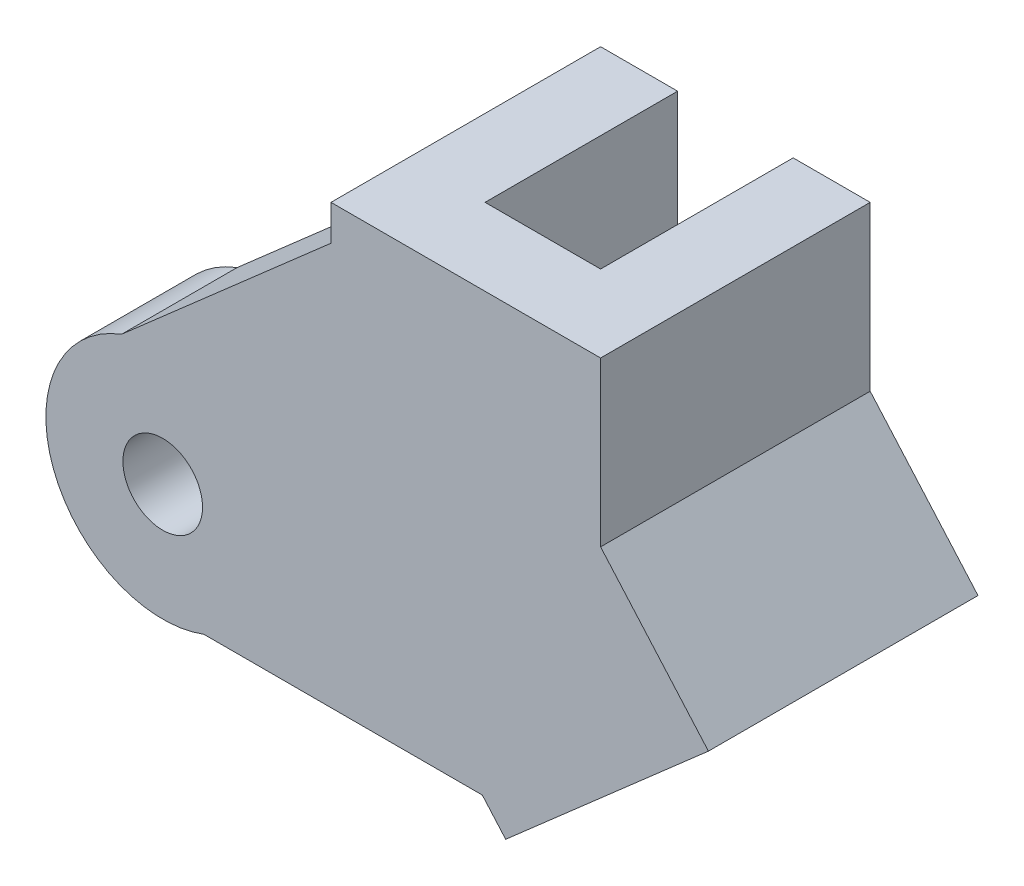
ISO-10303-21;
HEADER;
FILE_DESCRIPTION(('STEP AP214'),'2;1');
FILE_NAME('part.step','',(''),(''),'','','');
FILE_SCHEMA(('AUTOMOTIVE_DESIGN { 1 0 10303 214 1 1 1 1 }'));
ENDSEC;
DATA;
#1=APPLICATION_CONTEXT('core data for automotive mechanical design processes');
#2=APPLICATION_PROTOCOL_DEFINITION('international standard','automotive_design',2000,#1);
#3=PRODUCT_CONTEXT('',#1,'mechanical');
#4=PRODUCT('Part','Part','',(#3));
#5=PRODUCT_RELATED_PRODUCT_CATEGORY('part','',(#4));
#6=PRODUCT_DEFINITION_FORMATION('','',#4);
#7=PRODUCT_DEFINITION_CONTEXT('part definition',#1,'design');
#8=PRODUCT_DEFINITION('design','',#6,#7);
#9=PRODUCT_DEFINITION_SHAPE('','',#8);
#10=(LENGTH_UNIT() NAMED_UNIT(*) SI_UNIT(.MILLI.,.METRE.));
#11=(NAMED_UNIT(*) PLANE_ANGLE_UNIT() SI_UNIT($,.RADIAN.));
#12=(NAMED_UNIT(*) SI_UNIT($,.STERADIAN.) SOLID_ANGLE_UNIT());
#13=UNCERTAINTY_MEASURE_WITH_UNIT(LENGTH_MEASURE(1.E-05),#10,'distance_accuracy_value','');
#14=(GEOMETRIC_REPRESENTATION_CONTEXT(3) GLOBAL_UNCERTAINTY_ASSIGNED_CONTEXT((#13)) GLOBAL_UNIT_ASSIGNED_CONTEXT((#10,
#11,#12)) REPRESENTATION_CONTEXT('',''));
#15=CARTESIAN_POINT('',(0.,0.,0.));
#16=DIRECTION('',(0.,0.,1.));
#17=DIRECTION('',(1.,0.,0.));
#18=AXIS2_PLACEMENT_3D('',#15,#16,#17);
#19=CARTESIAN_POINT('',(-15.505514798512,40.409303061196,2.));
#20=DIRECTION('',(1.,0.,0.));
#21=DIRECTION('',(0.,0.,-1.));
#22=AXIS2_PLACEMENT_3D('',#19,#20,#21);
#23=PLANE('',#22);
#24=DIRECTION('',(0.,0.,1.));
#25=VECTOR('',#24,1.);
#26=CARTESIAN_POINT('',(-15.505514798512,39.490034108085,-1.));
#27=LINE('',#26,#25);
#28=CARTESIAN_POINT('',(-15.505514798512,39.490034108085,-1.));
#29=VERTEX_POINT('',#28);
#30=CARTESIAN_POINT('',(-15.505514798512,39.490034108085,2.));
#31=VERTEX_POINT('',#30);
#32=EDGE_CURVE('E168',#29,#31,#27,.T.);
#33=ORIENTED_EDGE('',*,*,#32,.T.);
#34=DIRECTION('',(0.,-1.,0.));
#35=VECTOR('',#34,1.);
#36=CARTESIAN_POINT('',(-15.505514798512,40.409303061196,2.));
#37=LINE('',#36,#35);
#38=CARTESIAN_POINT('',(-15.505514798512,40.409303061196,2.));
#39=VERTEX_POINT('',#38);
#40=EDGE_CURVE('E235',#39,#31,#37,.T.);
#41=ORIENTED_EDGE('',*,*,#40,.F.);
#42=DIRECTION('',(0.,0.,-1.));
#43=VECTOR('',#42,1.);
#44=CARTESIAN_POINT('',(-15.505514798512,40.409303061196,2.));
#45=LINE('',#44,#43);
#46=CARTESIAN_POINT('',(-15.505514798512,40.409303061196,-5.00000000000001));
#47=VERTEX_POINT('',#46);
#48=EDGE_CURVE('E243',#39,#47,#45,.T.);
#49=ORIENTED_EDGE('',*,*,#48,.T.);
#50=DIRECTION('',(0.,1.,0.));
#51=VECTOR('',#50,1.);
#52=CARTESIAN_POINT('',(-15.505514798512,0.,-5.00000000000001));
#53=LINE('',#52,#51);
#54=CARTESIAN_POINT('',(-15.505514798512,33.5282825945531,-5.00000000000001));
#55=VERTEX_POINT('',#54);
#56=EDGE_CURVE('E199',#55,#47,#53,.T.);
#57=ORIENTED_EDGE('',*,*,#56,.F.);
#58=DIRECTION('',(0.,0.,-1.));
#59=VECTOR('',#58,1.);
#60=CARTESIAN_POINT('',(-15.505514798512,33.5282825945531,2.));
#61=LINE('',#60,#59);
#62=CARTESIAN_POINT('',(-15.505514798512,33.5282825945531,-1.));
#63=VERTEX_POINT('',#62);
#64=EDGE_CURVE('E238',#63,#55,#61,.T.);
#65=ORIENTED_EDGE('',*,*,#64,.F.);
#66=DIRECTION('',(0.,-1.,0.));
#67=VECTOR('',#66,1.);
#68=CARTESIAN_POINT('',(-15.505514798512,0.,-1.));
#69=LINE('',#68,#67);
#70=EDGE_CURVE('E162',#29,#63,#69,.T.);
#71=ORIENTED_EDGE('',*,*,#70,.F.);
#72=EDGE_LOOP('',(#33,#41,#49,#57,#65,#71));
#73=FACE_BOUND('',#72,.T.);
#74=ADVANCED_FACE('F39',(#73),#23,.F.);
#75=CARTESIAN_POINT('',(0.,0.,0.));
#76=DIRECTION('',(0.,0.,1.));
#77=DIRECTION('',(1.,0.,0.));
#78=AXIS2_PLACEMENT_3D('',#75,#76,#77);
#79=PLANE('',#78);
#80=DIRECTION('',(0.,-1.,0.));
#81=VECTOR('',#80,1.);
#82=CARTESIAN_POINT('',(-13.505514798512,0.,0.));
#83=LINE('',#82,#81);
#84=CARTESIAN_POINT('',(-13.505514798512,40.409303061196,0.));
#85=VERTEX_POINT('',#84);
#86=CARTESIAN_POINT('',(-13.505514798512,34.2806907812103,0.));
#87=VERTEX_POINT('',#86);
#88=EDGE_CURVE('E192',#85,#87,#83,.T.);
#89=ORIENTED_EDGE('',*,*,#88,.F.);
#90=DIRECTION('',(-1.,0.,0.));
#91=VECTOR('',#90,1.);
#92=CARTESIAN_POINT('',(-8.50551479851198,40.409303061196,0.));
#93=LINE('',#92,#91);
#94=CARTESIAN_POINT('',(-10.505514798512,40.409303061196,0.));
#95=VERTEX_POINT('',#94);
#96=EDGE_CURVE('E224',#95,#85,#93,.T.);
#97=ORIENTED_EDGE('',*,*,#96,.F.);
#98=DIRECTION('',(0.,1.,0.));
#99=VECTOR('',#98,1.);
#100=CARTESIAN_POINT('',(-10.505514798512,0.,0.));
#101=LINE('',#100,#99);
#102=CARTESIAN_POINT('',(-10.505514798512,35.409303061196,0.));
#103=VERTEX_POINT('',#102);
#104=EDGE_CURVE('E252',#103,#95,#101,.T.);
#105=ORIENTED_EDGE('',*,*,#104,.F.);
#106=DIRECTION('',(-0.659122846656181,0.752035287081566,0.));
#107=VECTOR('',#106,1.);
#108=CARTESIAN_POINT('',(11.6103440031896,10.1759094573042,0.));
#109=LINE('',#108,#107);
#110=CARTESIAN_POINT('',(-7.20990056523107,31.6491266257881,0.));
#111=VERTEX_POINT('',#110);
#112=EDGE_CURVE('E247',#111,#103,#109,.T.);
#113=ORIENTED_EDGE('',*,*,#112,.F.);
#114=DIRECTION('',(0.752035287081566,0.659122846656181,0.));
#115=VECTOR('',#114,1.);
#116=CARTESIAN_POINT('',(-10.9700770006389,28.3535123925072,0.));
#117=LINE('',#116,#115);
#118=CARTESIAN_POINT('',(-9.46600642647577,29.6717580858196,0.));
#119=VERTEX_POINT('',#118);
#120=EDGE_CURVE('E220',#119,#111,#117,.T.);
#121=ORIENTED_EDGE('',*,*,#120,.F.);
#122=DIRECTION('',(0.659122846656181,-0.752035287081565,0.));
#123=VECTOR('',#122,1.);
#124=CARTESIAN_POINT('',(9.35423814194486,8.19854091733571,0.));
#125=LINE('',#124,#123);
#126=EDGE_CURVE('E200',#87,#119,#125,.T.);
#127=ORIENTED_EDGE('',*,*,#126,.F.);
#128=EDGE_LOOP('',(#89,#97,#105,#113,#121,#127));
#129=FACE_BOUND('',#128,.T.);
#130=ADVANCED_FACE('F325',(#129),#79,.F.);
#131=CARTESIAN_POINT('',(-8.50551479851198,0.,-5.00000000000001));
#132=DIRECTION('',(-1.,0.,0.));
#133=DIRECTION('',(0.,0.,1.));
#134=AXIS2_PLACEMENT_3D('',#131,#132,#133);
#135=PLANE('',#134);
#136=DIRECTION('',(0.,0.,1.));
#137=VECTOR('',#136,1.);
#138=CARTESIAN_POINT('',(-8.50551479851198,40.409303061196,-5.00000000000001));
#139=LINE('',#138,#137);
#140=CARTESIAN_POINT('',(-8.50551479851198,40.409303061196,-5.00000000000001));
#141=VERTEX_POINT('',#140);
#142=CARTESIAN_POINT('',(-8.50551479851198,40.409303061196,2.));
#143=VERTEX_POINT('',#142);
#144=EDGE_CURVE('E262',#141,#143,#139,.T.);
#145=ORIENTED_EDGE('',*,*,#144,.T.);
#146=DIRECTION('',(0.,1.,0.));
#147=VECTOR('',#146,1.);
#148=CARTESIAN_POINT('',(-8.50551479851198,36.1617112478531,2.));
#149=LINE('',#148,#147);
#150=CARTESIAN_POINT('',(-8.50551479851198,36.1617112478531,2.));
#151=VERTEX_POINT('',#150);
#152=EDGE_CURVE('E230',#151,#143,#149,.T.);
#153=ORIENTED_EDGE('',*,*,#152,.F.);
#154=DIRECTION('',(0.,0.,1.));
#155=VECTOR('',#154,1.);
#156=CARTESIAN_POINT('',(-8.50551479851198,36.1617112478531,-5.00000000000001));
#157=LINE('',#156,#155);
#158=CARTESIAN_POINT('',(-8.50551479851198,36.1617112478531,-5.00000000000001));
#159=VERTEX_POINT('',#158);
#160=EDGE_CURVE('E11',#159,#151,#157,.T.);
#161=ORIENTED_EDGE('',*,*,#160,.F.);
#162=DIRECTION('',(0.,-1.,0.));
#163=VECTOR('',#162,1.);
#164=CARTESIAN_POINT('',(-8.50551479851198,0.,-5.00000000000001));
#165=LINE('',#164,#163);
#166=EDGE_CURVE('E248',#141,#159,#165,.T.);
#167=ORIENTED_EDGE('',*,*,#166,.F.);
#168=EDGE_LOOP('',(#145,#153,#161,#167));
#169=FACE_BOUND('',#168,.T.);
#170=ADVANCED_FACE('F41',(#169),#135,.F.);
#171=CARTESIAN_POINT('',(13.1144145773527,11.4941551506166,-5.00000000000001));
#172=DIRECTION('',(-0.752035287081566,-0.659122846656181,0.));
#173=DIRECTION('',(0.659122846656181,-0.752035287081566,0.));
#174=AXIS2_PLACEMENT_3D('',#171,#172,#173);
#175=PLANE('',#174);
#176=ORIENTED_EDGE('',*,*,#160,.T.);
#177=DIRECTION('',(-0.659122846656181,0.752035287081566,0.));
#178=VECTOR('',#177,1.);
#179=CARTESIAN_POINT('',(-5.70582999106794,32.9673723191005,2.));
#180=LINE('',#179,#178);
#181=CARTESIAN_POINT('',(-5.70582999106794,32.9673723191005,2.));
#182=VERTEX_POINT('',#181);
#183=EDGE_CURVE('E227',#182,#151,#180,.T.);
#184=ORIENTED_EDGE('',*,*,#183,.F.);
#185=DIRECTION('',(0.,0.,1.));
#186=VECTOR('',#185,1.);
#187=CARTESIAN_POINT('',(-5.70582999106794,32.9673723191005,-5.00000000000001));
#188=LINE('',#187,#186);
#189=CARTESIAN_POINT('',(-5.70582999106794,32.9673723191005,-5.00000000000001));
#190=VERTEX_POINT('',#189);
#191=EDGE_CURVE('E47',#190,#182,#188,.T.);
#192=ORIENTED_EDGE('',*,*,#191,.F.);
#193=DIRECTION('',(0.659122846656181,-0.752035287081566,0.));
#194=VECTOR('',#193,1.);
#195=CARTESIAN_POINT('',(13.1144145773527,11.4941551506166,-5.00000000000001));
#196=LINE('',#195,#194);
#197=EDGE_CURVE('E251',#159,#190,#196,.T.);
#198=ORIENTED_EDGE('',*,*,#197,.F.);
#199=EDGE_LOOP('',(#176,#184,#192,#198));
#200=FACE_BOUND('',#199,.T.);
#201=ADVANCED_FACE('F288',(#200),#175,.F.);
#202=CARTESIAN_POINT('',(-18.8202445684206,21.4732171684839,-5.00000000000001));
#203=DIRECTION('',(-0.659122846656181,0.752035287081566,0.));
#204=DIRECTION('',(-0.752035287081566,-0.659122846656181,0.));
#205=AXIS2_PLACEMENT_3D('',#202,#203,#204);
#206=PLANE('',#205);
#207=ORIENTED_EDGE('',*,*,#191,.T.);
#208=DIRECTION('',(0.752035287081566,0.659122846656181,0.));
#209=VECTOR('',#208,1.);
#210=CARTESIAN_POINT('',(-10.9700770006389,28.3535123925072,2.));
#211=LINE('',#210,#209);
#212=CARTESIAN_POINT('',(-10.9700770006389,28.3535123925072,2.));
#213=VERTEX_POINT('',#212);
#214=EDGE_CURVE('E223',#213,#182,#211,.T.);
#215=ORIENTED_EDGE('',*,*,#214,.F.);
#216=DIRECTION('',(0.,0.,-1.));
#217=VECTOR('',#216,1.);
#218=CARTESIAN_POINT('',(-10.9700770006389,28.3535123925072,2.));
#219=LINE('',#218,#217);
#220=CARTESIAN_POINT('',(-10.9700770006389,28.3535123925072,-5.00000000000001));
#221=VERTEX_POINT('',#220);
#222=EDGE_CURVE('E245',#213,#221,#219,.T.);
#223=ORIENTED_EDGE('',*,*,#222,.T.);
#224=DIRECTION('',(-0.752035287081566,-0.659122846656181,0.));
#225=VECTOR('',#224,1.);
#226=CARTESIAN_POINT('',(-18.8202445684206,21.4732171684839,-5.00000000000001));
#227=LINE('',#226,#225);
#228=CARTESIAN_POINT('',(-9.46600642647577,29.6717580858196,-5.00000000000001));
#229=VERTEX_POINT('',#228);
#230=EDGE_CURVE('E209',#229,#221,#227,.T.);
#231=ORIENTED_EDGE('',*,*,#230,.F.);
#232=DIRECTION('',(0.,0.,1.));
#233=VECTOR('',#232,1.);
#234=CARTESIAN_POINT('',(-9.46600642647577,29.6717580858196,-5.00000000000001));
#235=LINE('',#234,#233);
#236=EDGE_CURVE('E62',#229,#119,#235,.T.);
#237=ORIENTED_EDGE('',*,*,#236,.T.);
#238=ORIENTED_EDGE('',*,*,#120,.T.);
#239=DIRECTION('',(0.,0.,1.));
#240=VECTOR('',#239,1.);
#241=CARTESIAN_POINT('',(-7.20990056523107,31.6491266257881,-5.00000000000001));
#242=LINE('',#241,#240);
#243=CARTESIAN_POINT('',(-7.20990056523107,31.6491266257881,-5.00000000000001));
#244=VERTEX_POINT('',#243);
#245=EDGE_CURVE('E274',#244,#111,#242,.T.);
#246=ORIENTED_EDGE('',*,*,#245,.F.);
#247=DIRECTION('',(-0.752035287081566,-0.659122846656181,0.));
#248=VECTOR('',#247,1.);
#249=CARTESIAN_POINT('',(-18.8202445684206,21.4732171684839,-5.00000000000001));
#250=LINE('',#249,#248);
#251=EDGE_CURVE('E254',#190,#244,#250,.T.);
#252=ORIENTED_EDGE('',*,*,#251,.F.);
#253=EDGE_LOOP('',(#207,#215,#223,#231,#237,#238,#246,#252));
#254=FACE_BOUND('',#253,.T.);
#255=ADVANCED_FACE('F279',(#254),#206,.F.);
#256=CARTESIAN_POINT('',(11.6103440031896,10.1759094573042,-5.00000000000001));
#257=DIRECTION('',(0.752035287081566,0.659122846656181,0.));
#258=DIRECTION('',(-0.659122846656181,0.752035287081566,0.));
#259=AXIS2_PLACEMENT_3D('',#256,#257,#258);
#260=PLANE('',#259);
#261=ORIENTED_EDGE('',*,*,#112,.T.);
#262=DIRECTION('',(0.,0.,1.));
#263=VECTOR('',#262,1.);
#264=CARTESIAN_POINT('',(-10.505514798512,35.409303061196,-5.00000000000001));
#265=LINE('',#264,#263);
#266=CARTESIAN_POINT('',(-10.505514798512,35.409303061196,-5.00000000000001));
#267=VERTEX_POINT('',#266);
#268=EDGE_CURVE('E271',#267,#103,#265,.T.);
#269=ORIENTED_EDGE('',*,*,#268,.F.);
#270=DIRECTION('',(-0.659122846656181,0.752035287081566,0.));
#271=VECTOR('',#270,1.);
#272=CARTESIAN_POINT('',(11.6103440031896,10.1759094573042,-5.00000000000001));
#273=LINE('',#272,#271);
#274=EDGE_CURVE('E256',#244,#267,#273,.T.);
#275=ORIENTED_EDGE('',*,*,#274,.F.);
#276=ORIENTED_EDGE('',*,*,#245,.T.);
#277=EDGE_LOOP('',(#261,#269,#275,#276));
#278=FACE_BOUND('',#277,.T.);
#279=ADVANCED_FACE('F346',(#278),#260,.F.);
#280=CARTESIAN_POINT('',(-10.505514798512,0.,-5.00000000000001));
#281=DIRECTION('',(1.,0.,0.));
#282=DIRECTION('',(0.,0.,-1.));
#283=AXIS2_PLACEMENT_3D('',#280,#281,#282);
#284=PLANE('',#283);
#285=ORIENTED_EDGE('',*,*,#104,.T.);
#286=DIRECTION('',(0.,0.,1.));
#287=VECTOR('',#286,1.);
#288=CARTESIAN_POINT('',(-10.505514798512,40.409303061196,-5.00000000000001));
#289=LINE('',#288,#287);
#290=CARTESIAN_POINT('',(-10.505514798512,40.409303061196,-5.00000000000001));
#291=VERTEX_POINT('',#290);
#292=EDGE_CURVE('E268',#291,#95,#289,.T.);
#293=ORIENTED_EDGE('',*,*,#292,.F.);
#294=DIRECTION('',(0.,1.,0.));
#295=VECTOR('',#294,1.);
#296=CARTESIAN_POINT('',(-10.505514798512,0.,-5.00000000000001));
#297=LINE('',#296,#295);
#298=EDGE_CURVE('E258',#267,#291,#297,.T.);
#299=ORIENTED_EDGE('',*,*,#298,.F.);
#300=ORIENTED_EDGE('',*,*,#268,.T.);
#301=EDGE_LOOP('',(#285,#293,#299,#300));
#302=FACE_BOUND('',#301,.T.);
#303=ADVANCED_FACE('F343',(#302),#284,.F.);
#304=CARTESIAN_POINT('',(-1.40197933336236E-13,40.409303061196,-5.00000000000001));
#305=DIRECTION('',(0.,-1.,0.));
#306=DIRECTION('',(1.,0.,0.));
#307=AXIS2_PLACEMENT_3D('',#304,#305,#306);
#308=PLANE('',#307);
#309=ORIENTED_EDGE('',*,*,#292,.T.);
#310=ORIENTED_EDGE('',*,*,#96,.T.);
#311=DIRECTION('',(0.,0.,1.));
#312=VECTOR('',#311,1.);
#313=CARTESIAN_POINT('',(-13.505514798512,40.409303061196,-5.00000000000001));
#314=LINE('',#313,#312);
#315=CARTESIAN_POINT('',(-13.505514798512,40.409303061196,-5.00000000000001));
#316=VERTEX_POINT('',#315);
#317=EDGE_CURVE('E218',#316,#85,#314,.T.);
#318=ORIENTED_EDGE('',*,*,#317,.F.);
#319=DIRECTION('',(1.,0.,0.));
#320=VECTOR('',#319,1.);
#321=CARTESIAN_POINT('',(1.40197933336236E-13,40.4093030611959,-5.00000000000001));
#322=LINE('',#321,#320);
#323=EDGE_CURVE('E203',#47,#316,#322,.T.);
#324=ORIENTED_EDGE('',*,*,#323,.F.);
#325=ORIENTED_EDGE('',*,*,#48,.F.);
#326=DIRECTION('',(-1.,0.,0.));
#327=VECTOR('',#326,1.);
#328=CARTESIAN_POINT('',(-8.50551479851198,40.409303061196,2.));
#329=LINE('',#328,#327);
#330=EDGE_CURVE('E233',#143,#39,#329,.T.);
#331=ORIENTED_EDGE('',*,*,#330,.F.);
#332=ORIENTED_EDGE('',*,*,#144,.F.);
#333=DIRECTION('',(1.,0.,0.));
#334=VECTOR('',#333,1.);
#335=CARTESIAN_POINT('',(-1.40197933336236E-13,40.409303061196,-5.00000000000001));
#336=LINE('',#335,#334);
#337=EDGE_CURVE('E260',#291,#141,#336,.T.);
#338=ORIENTED_EDGE('',*,*,#337,.F.);
#339=EDGE_LOOP('',(#309,#310,#318,#324,#325,#331,#332,#338));
#340=FACE_BOUND('',#339,.T.);
#341=ADVANCED_FACE('F296',(#340),#308,.F.);
#342=CARTESIAN_POINT('',(0.,0.,-5.00000000000001));
#343=DIRECTION('',(0.,0.,1.));
#344=DIRECTION('',(1.,0.,0.));
#345=AXIS2_PLACEMENT_3D('',#342,#343,#344);
#346=PLANE('',#345);
#347=ORIENTED_EDGE('',*,*,#166,.T.);
#348=ORIENTED_EDGE('',*,*,#197,.T.);
#349=ORIENTED_EDGE('',*,*,#251,.T.);
#350=ORIENTED_EDGE('',*,*,#274,.T.);
#351=ORIENTED_EDGE('',*,*,#298,.T.);
#352=ORIENTED_EDGE('',*,*,#337,.T.);
#353=EDGE_LOOP('',(#347,#348,#349,#350,#351,#352));
#354=FACE_BOUND('',#353,.T.);
#355=ADVANCED_FACE('F337',(#354),#346,.F.);
#356=CARTESIAN_POINT('',(-15.505514798512,33.5282825945531,2.));
#357=DIRECTION('',(0.752035287081566,0.659122846656181,0.));
#358=DIRECTION('',(-0.659122846656181,0.752035287081566,0.));
#359=AXIS2_PLACEMENT_3D('',#356,#357,#358);
#360=PLANE('',#359);
#361=DIRECTION('',(0.659122846656181,-0.752035287081566,0.));
#362=VECTOR('',#361,1.);
#363=CARTESIAN_POINT('',(-15.505514798512,33.5282825945531,2.));
#364=LINE('',#363,#362);
#365=CARTESIAN_POINT('',(-11.575988169856,29.0448350835652,2.));
#366=VERTEX_POINT('',#365);
#367=EDGE_CURVE('E221',#366,#213,#364,.T.);
#368=ORIENTED_EDGE('',*,*,#367,.F.);
#369=DIRECTION('',(0.,0.,1.));
#370=VECTOR('',#369,1.);
#371=CARTESIAN_POINT('',(-11.575988169856,29.0448350835652,-1.));
#372=LINE('',#371,#370);
#373=CARTESIAN_POINT('',(-11.575988169856,29.0448350835652,-1.));
#374=VERTEX_POINT('',#373);
#375=EDGE_CURVE('E193',#374,#366,#372,.T.);
#376=ORIENTED_EDGE('',*,*,#375,.F.);
#377=DIRECTION('',(0.659122846656181,-0.752035287081566,0.));
#378=VECTOR('',#377,1.);
#379=CARTESIAN_POINT('',(7.85016756778173,6.88029522402334,-1.));
#380=LINE('',#379,#378);
#381=EDGE_CURVE('E178',#63,#374,#380,.T.);
#382=ORIENTED_EDGE('',*,*,#381,.F.);
#383=ORIENTED_EDGE('',*,*,#64,.T.);
#384=DIRECTION('',(-0.659122846656181,0.752035287081565,0.));
#385=VECTOR('',#384,1.);
#386=CARTESIAN_POINT('',(7.85016756778174,6.88029522402337,-5.00000000000001));
#387=LINE('',#386,#385);
#388=EDGE_CURVE('E196',#221,#55,#387,.T.);
#389=ORIENTED_EDGE('',*,*,#388,.F.);
#390=ORIENTED_EDGE('',*,*,#222,.F.);
#391=EDGE_LOOP('',(#368,#376,#382,#383,#389,#390));
#392=FACE_BOUND('',#391,.T.);
#393=ADVANCED_FACE('F307',(#392),#360,.F.);
#394=CARTESIAN_POINT('',(0.,0.,2.));
#395=DIRECTION('',(0.,0.,1.));
#396=DIRECTION('',(1.,0.,0.));
#397=AXIS2_PLACEMENT_3D('',#394,#395,#396);
#398=PLANE('',#397);
#399=ORIENTED_EDGE('',*,*,#40,.T.);
#400=DIRECTION('',(0.752035287081566,0.659122846656181,0.));
#401=VECTOR('',#400,1.);
#402=CARTESIAN_POINT('',(-26.3108250525696,30.0196981065707,2.));
#403=LINE('',#402,#401);
#404=CARTESIAN_POINT('',(-20.9434159158274,34.7239746879357,2.));
#405=VERTEX_POINT('',#404);
#406=EDGE_CURVE('E187',#405,#31,#403,.T.);
#407=ORIENTED_EDGE('',*,*,#406,.F.);
#408=CARTESIAN_POINT('',(-19.8751581329531,31.8844048857505,2.));
#409=DIRECTION('',(0.,0.,1.));
#410=DIRECTION('',(1.,0.,0.));
#411=AXIS2_PLACEMENT_3D('',#408,#409,#410);
#412=CIRCLE('',#411,3.03386409586091);
#413=CARTESIAN_POINT('',(-18.8069003500788,29.0448350835652,2.));
#414=VERTEX_POINT('',#413);
#415=EDGE_CURVE('E158',#405,#414,#412,.T.);
#416=ORIENTED_EDGE('',*,*,#415,.T.);
#417=DIRECTION('',(1.,0.,0.));
#418=VECTOR('',#417,1.);
#419=CARTESIAN_POINT('',(0.,29.0448350835652,2.));
#420=LINE('',#419,#418);
#421=EDGE_CURVE('E54',#414,#366,#420,.T.);
#422=ORIENTED_EDGE('',*,*,#421,.T.);
#423=ORIENTED_EDGE('',*,*,#367,.T.);
#424=ORIENTED_EDGE('',*,*,#214,.T.);
#425=ORIENTED_EDGE('',*,*,#183,.T.);
#426=ORIENTED_EDGE('',*,*,#152,.T.);
#427=ORIENTED_EDGE('',*,*,#330,.T.);
#428=EDGE_LOOP('',(#399,#407,#416,#422,#423,#424,#425,#426,#427));
#429=FACE_BOUND('',#428,.T.);
#430=CARTESIAN_POINT('',(-19.8751581329531,31.8844048857505,2.));
#431=DIRECTION('',(0.,0.,1.));
#432=DIRECTION('',(1.,0.,0.));
#433=AXIS2_PLACEMENT_3D('',#430,#431,#432);
#434=CIRCLE('',#433,1.0338640958609);
#435=CARTESIAN_POINT('',(-18.8412940370922,31.8844048857505,2.));
#436=VERTEX_POINT('',#435);
#437=EDGE_CURVE('E184',#436,#436,#434,.T.);
#438=ORIENTED_EDGE('',*,*,#437,.F.);
#439=EDGE_LOOP('',(#438));
#440=FACE_BOUND('',#439,.T.);
#441=ADVANCED_FACE('F284',(#429,#440),#398,.T.);
#442=CARTESIAN_POINT('',(-13.505514798512,0.,-5.00000000000001));
#443=DIRECTION('',(-1.,0.,0.));
#444=DIRECTION('',(0.,0.,1.));
#445=AXIS2_PLACEMENT_3D('',#442,#443,#444);
#446=PLANE('',#445);
#447=ORIENTED_EDGE('',*,*,#88,.T.);
#448=DIRECTION('',(0.,0.,1.));
#449=VECTOR('',#448,1.);
#450=CARTESIAN_POINT('',(-13.505514798512,34.2806907812103,-5.00000000000001));
#451=LINE('',#450,#449);
#452=CARTESIAN_POINT('',(-13.505514798512,34.2806907812103,-5.00000000000001));
#453=VERTEX_POINT('',#452);
#454=EDGE_CURVE('E215',#453,#87,#451,.T.);
#455=ORIENTED_EDGE('',*,*,#454,.F.);
#456=DIRECTION('',(0.,-1.,0.));
#457=VECTOR('',#456,1.);
#458=CARTESIAN_POINT('',(-13.505514798512,0.,-5.00000000000001));
#459=LINE('',#458,#457);
#460=EDGE_CURVE('E205',#316,#453,#459,.T.);
#461=ORIENTED_EDGE('',*,*,#460,.F.);
#462=ORIENTED_EDGE('',*,*,#317,.T.);
#463=EDGE_LOOP('',(#447,#455,#461,#462));
#464=FACE_BOUND('',#463,.T.);
#465=ADVANCED_FACE('F376',(#464),#446,.F.);
#466=CARTESIAN_POINT('',(9.35423814194486,8.19854091733571,-5.00000000000001));
#467=DIRECTION('',(-0.752035287081565,-0.659122846656181,0.));
#468=DIRECTION('',(0.659122846656181,-0.752035287081565,0.));
#469=AXIS2_PLACEMENT_3D('',#466,#467,#468);
#470=PLANE('',#469);
#471=ORIENTED_EDGE('',*,*,#126,.T.);
#472=ORIENTED_EDGE('',*,*,#236,.F.);
#473=DIRECTION('',(0.659122846656181,-0.752035287081565,0.));
#474=VECTOR('',#473,1.);
#475=CARTESIAN_POINT('',(9.35423814194486,8.19854091733571,-5.00000000000001));
#476=LINE('',#475,#474);
#477=EDGE_CURVE('E207',#453,#229,#476,.T.);
#478=ORIENTED_EDGE('',*,*,#477,.F.);
#479=ORIENTED_EDGE('',*,*,#454,.T.);
#480=EDGE_LOOP('',(#471,#472,#478,#479));
#481=FACE_BOUND('',#480,.T.);
#482=ADVANCED_FACE('F381',(#481),#470,.F.);
#483=CARTESIAN_POINT('',(0.,0.,-5.00000000000001));
#484=DIRECTION('',(0.,0.,1.));
#485=DIRECTION('',(1.,0.,0.));
#486=AXIS2_PLACEMENT_3D('',#483,#484,#485);
#487=PLANE('',#486);
#488=ORIENTED_EDGE('',*,*,#388,.T.);
#489=ORIENTED_EDGE('',*,*,#56,.T.);
#490=ORIENTED_EDGE('',*,*,#323,.T.);
#491=ORIENTED_EDGE('',*,*,#460,.T.);
#492=ORIENTED_EDGE('',*,*,#477,.T.);
#493=ORIENTED_EDGE('',*,*,#230,.T.);
#494=EDGE_LOOP('',(#488,#489,#490,#491,#492,#493));
#495=FACE_BOUND('',#494,.T.);
#496=ADVANCED_FACE('F320',(#495),#487,.F.);
#497=CARTESIAN_POINT('',(-26.3108250525696,30.0196981065707,-1.));
#498=DIRECTION('',(0.659122846656181,-0.752035287081566,0.));
#499=DIRECTION('',(0.752035287081566,0.659122846656181,0.));
#500=AXIS2_PLACEMENT_3D('',#497,#498,#499);
#501=PLANE('',#500);
#502=ORIENTED_EDGE('',*,*,#406,.T.);
#503=ORIENTED_EDGE('',*,*,#32,.F.);
#504=DIRECTION('',(0.752035287081566,0.659122846656181,0.));
#505=VECTOR('',#504,1.);
#506=CARTESIAN_POINT('',(-26.3108250525696,30.0196981065707,-1.));
#507=LINE('',#506,#505);
#508=CARTESIAN_POINT('',(-20.9434159158274,34.7239746879357,-1.));
#509=VERTEX_POINT('',#508);
#510=EDGE_CURVE('E165',#509,#29,#507,.T.);
#511=ORIENTED_EDGE('',*,*,#510,.F.);
#512=DIRECTION('',(0.,0.,1.));
#513=VECTOR('',#512,1.);
#514=CARTESIAN_POINT('',(-20.9434159158274,34.7239746879357,-1.));
#515=LINE('',#514,#513);
#516=EDGE_CURVE('E153',#509,#405,#515,.T.);
#517=ORIENTED_EDGE('',*,*,#516,.T.);
#518=EDGE_LOOP('',(#502,#503,#511,#517));
#519=FACE_BOUND('',#518,.T.);
#520=ADVANCED_FACE('F166',(#519),#501,.F.);
#521=CARTESIAN_POINT('',(0.,29.0448350835652,-1.));
#522=DIRECTION('',(0.,-1.,0.));
#523=DIRECTION('',(0.,0.,-1.));
#524=AXIS2_PLACEMENT_3D('',#521,#522,#523);
#525=PLANE('',#524);
#526=ORIENTED_EDGE('',*,*,#421,.F.);
#527=DIRECTION('',(0.,0.,1.));
#528=VECTOR('',#527,1.);
#529=CARTESIAN_POINT('',(-18.8069003500788,29.0448350835652,-1.));
#530=LINE('',#529,#528);
#531=CARTESIAN_POINT('',(-18.8069003500788,29.0448350835652,-1.));
#532=VERTEX_POINT('',#531);
#533=EDGE_CURVE('E161',#532,#414,#530,.T.);
#534=ORIENTED_EDGE('',*,*,#533,.F.);
#535=DIRECTION('',(1.,0.,0.));
#536=VECTOR('',#535,1.);
#537=CARTESIAN_POINT('',(0.,29.0448350835652,-1.));
#538=LINE('',#537,#536);
#539=EDGE_CURVE('E176',#532,#374,#538,.T.);
#540=ORIENTED_EDGE('',*,*,#539,.T.);
#541=ORIENTED_EDGE('',*,*,#375,.T.);
#542=EDGE_LOOP('',(#526,#534,#540,#541));
#543=FACE_BOUND('',#542,.T.);
#544=ADVANCED_FACE('F310',(#543),#525,.T.);
#545=CARTESIAN_POINT('',(-19.8751581329531,31.8844048857505,-1.));
#546=DIRECTION('',(0.,0.,1.));
#547=DIRECTION('',(1.,0.,0.));
#548=AXIS2_PLACEMENT_3D('',#545,#546,#547);
#549=CYLINDRICAL_SURFACE('',#548,1.0338640958609);
#550=CARTESIAN_POINT('',(-19.8751581329531,31.8844048857505,-1.));
#551=DIRECTION('',(0.,0.,1.));
#552=DIRECTION('',(1.,0.,0.));
#553=AXIS2_PLACEMENT_3D('',#550,#551,#552);
#554=CIRCLE('',#553,1.0338640958609);
#555=CARTESIAN_POINT('',(-18.8412940370922,31.8844048857505,-1.));
#556=VERTEX_POINT('',#555);
#557=EDGE_CURVE('E171',#556,#556,#554,.T.);
#558=ORIENTED_EDGE('',*,*,#557,.F.);
#559=EDGE_LOOP('',(#558));
#560=FACE_BOUND('',#559,.T.);
#561=ORIENTED_EDGE('',*,*,#437,.T.);
#562=EDGE_LOOP('',(#561));
#563=FACE_BOUND('',#562,.T.);
#564=ADVANCED_FACE('F312',(#560,#563),#549,.F.);
#565=CARTESIAN_POINT('',(-19.8751581329531,31.8844048857505,-1.));
#566=DIRECTION('',(0.,0.,1.));
#567=DIRECTION('',(1.,0.,0.));
#568=AXIS2_PLACEMENT_3D('',#565,#566,#567);
#569=CYLINDRICAL_SURFACE('',#568,3.03386409586091);
#570=ORIENTED_EDGE('',*,*,#415,.F.);
#571=ORIENTED_EDGE('',*,*,#516,.F.);
#572=CARTESIAN_POINT('',(-19.8751581329531,31.8844048857505,-1.));
#573=DIRECTION('',(0.,0.,1.));
#574=DIRECTION('',(1.,0.,0.));
#575=AXIS2_PLACEMENT_3D('',#572,#573,#574);
#576=CIRCLE('',#575,3.03386409586091);
#577=EDGE_CURVE('E157',#509,#532,#576,.T.);
#578=ORIENTED_EDGE('',*,*,#577,.T.);
#579=ORIENTED_EDGE('',*,*,#533,.T.);
#580=EDGE_LOOP('',(#570,#571,#578,#579));
#581=FACE_BOUND('',#580,.T.);
#582=ADVANCED_FACE('F155',(#581),#569,.T.);
#583=CARTESIAN_POINT('',(0.,0.,-1.));
#584=DIRECTION('',(0.,0.,1.));
#585=DIRECTION('',(1.,0.,0.));
#586=AXIS2_PLACEMENT_3D('',#583,#584,#585);
#587=PLANE('',#586);
#588=ORIENTED_EDGE('',*,*,#557,.T.);
#589=EDGE_LOOP('',(#588));
#590=FACE_BOUND('',#589,.T.);
#591=ORIENTED_EDGE('',*,*,#510,.T.);
#592=ORIENTED_EDGE('',*,*,#70,.T.);
#593=ORIENTED_EDGE('',*,*,#381,.T.);
#594=ORIENTED_EDGE('',*,*,#539,.F.);
#595=ORIENTED_EDGE('',*,*,#577,.F.);
#596=EDGE_LOOP('',(#591,#592,#593,#594,#595));
#597=FACE_BOUND('',#596,.T.);
#598=ADVANCED_FACE('F174',(#590,#597),#587,.F.);
#599=CLOSED_SHELL('',(#74,#130,#170,#201,#255,#279,#303,#341,#355,#393,#441,#465,#482,#496,#520,
#544,#564,#582,#598));
#600=MANIFOLD_SOLID_BREP('B2',#599);
#601=ADVANCED_BREP_SHAPE_REPRESENTATION('',(#18,#600),#14);
#602=SHAPE_DEFINITION_REPRESENTATION(#9,#601);
ENDSEC;
END-ISO-10303-21;
